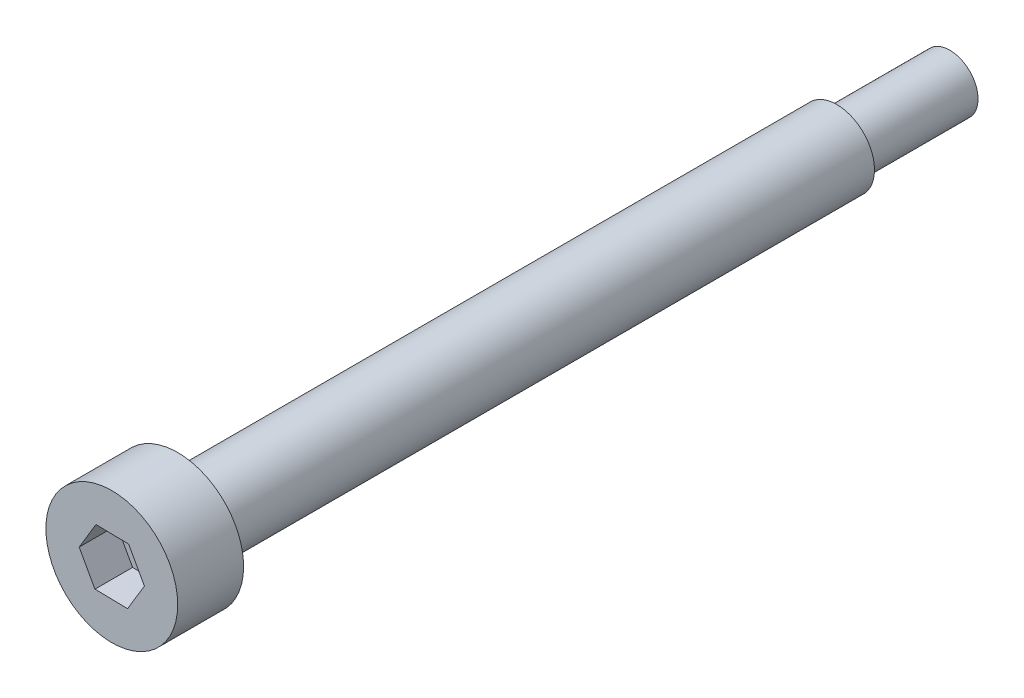
ISO-10303-21;
HEADER;
FILE_DESCRIPTION(('STEP AP214'),'2;1');
FILE_NAME('part.step','',(''),(''),'','','');
FILE_SCHEMA(('AUTOMOTIVE_DESIGN { 1 0 10303 214 1 1 1 1 }'));
ENDSEC;
DATA;
#1=APPLICATION_CONTEXT('core data for automotive mechanical design processes');
#2=APPLICATION_PROTOCOL_DEFINITION('international standard','automotive_design',2000,#1);
#3=PRODUCT_CONTEXT('',#1,'mechanical');
#4=PRODUCT('Part','Part','',(#3));
#5=PRODUCT_RELATED_PRODUCT_CATEGORY('part','',(#4));
#6=PRODUCT_DEFINITION_FORMATION('','',#4);
#7=PRODUCT_DEFINITION_CONTEXT('part definition',#1,'design');
#8=PRODUCT_DEFINITION('design','',#6,#7);
#9=PRODUCT_DEFINITION_SHAPE('','',#8);
#10=(LENGTH_UNIT() NAMED_UNIT(*) SI_UNIT(.MILLI.,.METRE.));
#11=(NAMED_UNIT(*) PLANE_ANGLE_UNIT() SI_UNIT($,.RADIAN.));
#12=(NAMED_UNIT(*) SI_UNIT($,.STERADIAN.) SOLID_ANGLE_UNIT());
#13=UNCERTAINTY_MEASURE_WITH_UNIT(LENGTH_MEASURE(1.E-05),#10,'distance_accuracy_value','');
#14=(GEOMETRIC_REPRESENTATION_CONTEXT(3) GLOBAL_UNCERTAINTY_ASSIGNED_CONTEXT((#13)) GLOBAL_UNIT_ASSIGNED_CONTEXT((#10,
#11,#12)) REPRESENTATION_CONTEXT('',''));
#15=CARTESIAN_POINT('',(0.,0.,0.));
#16=DIRECTION('',(0.,0.,1.));
#17=DIRECTION('',(1.,0.,0.));
#18=AXIS2_PLACEMENT_3D('',#15,#16,#17);
#19=CARTESIAN_POINT('',(0.,0.,3.5));
#20=DIRECTION('',(0.,0.,-1.));
#21=DIRECTION('',(-1.,0.,0.));
#22=AXIS2_PLACEMENT_3D('',#19,#20,#21);
#23=CYLINDRICAL_SURFACE('',#22,3.5);
#24=CARTESIAN_POINT('',(0.,0.,3.5));
#25=DIRECTION('',(0.,0.,1.));
#26=DIRECTION('',(1.,0.,0.));
#27=AXIS2_PLACEMENT_3D('',#24,#25,#26);
#28=CIRCLE('',#27,3.5);
#29=CARTESIAN_POINT('',(3.5,0.,3.5));
#30=VERTEX_POINT('',#29);
#31=EDGE_CURVE('E43',#30,#30,#28,.T.);
#32=ORIENTED_EDGE('',*,*,#31,.F.);
#33=EDGE_LOOP('',(#32));
#34=FACE_BOUND('',#33,.T.);
#35=CARTESIAN_POINT('',(0.,0.,0.));
#36=DIRECTION('',(0.,0.,1.));
#37=DIRECTION('',(1.,0.,0.));
#38=AXIS2_PLACEMENT_3D('',#35,#36,#37);
#39=CIRCLE('',#38,3.5);
#40=CARTESIAN_POINT('',(3.5,0.,0.));
#41=VERTEX_POINT('',#40);
#42=EDGE_CURVE('E138',#41,#41,#39,.T.);
#43=ORIENTED_EDGE('',*,*,#42,.T.);
#44=EDGE_LOOP('',(#43));
#45=FACE_BOUND('',#44,.T.);
#46=ADVANCED_FACE('F36',(#34,#45),#23,.T.);
#47=CARTESIAN_POINT('',(0.,0.,3.5));
#48=DIRECTION('',(0.,0.,1.));
#49=DIRECTION('',(1.,0.,0.));
#50=AXIS2_PLACEMENT_3D('',#47,#48,#49);
#51=PLANE('',#50);
#52=DIRECTION('',(-0.483885708586405,0.875131202178183,0.));
#53=VECTOR('',#52,1.);
#54=CARTESIAN_POINT('',(1.73175411943134,-0.0320572898511147,3.5));
#55=LINE('',#54,#53);
#56=CARTESIAN_POINT('',(1.73175411943134,-0.0320572898511147,3.5));
#57=VERTEX_POINT('',#56);
#58=CARTESIAN_POINT('',(0.893639487103215,1.48371441561033,3.5));
#59=VERTEX_POINT('',#58);
#60=EDGE_CURVE('E50',#57,#59,#55,.T.);
#61=ORIENTED_EDGE('',*,*,#60,.F.);
#62=DIRECTION('',(0.51594299843752,0.856622917253152,0.));
#63=VECTOR('',#62,1.);
#64=CARTESIAN_POINT('',(0.838114632328121,-1.51577170546145,3.5));
#65=LINE('',#64,#63);
#66=CARTESIAN_POINT('',(0.838114632328121,-1.51577170546145,3.5));
#67=VERTEX_POINT('',#66);
#68=EDGE_CURVE('E134',#67,#57,#65,.T.);
#69=ORIENTED_EDGE('',*,*,#68,.F.);
#70=DIRECTION('',(0.999828707023925,-0.0185082849250311,0.));
#71=VECTOR('',#70,1.);
#72=CARTESIAN_POINT('',(-0.893639487103214,-1.48371441561033,3.5));
#73=LINE('',#72,#71);
#74=CARTESIAN_POINT('',(-0.893639487103214,-1.48371441561033,3.5));
#75=VERTEX_POINT('',#74);
#76=EDGE_CURVE('E132',#75,#67,#73,.T.);
#77=ORIENTED_EDGE('',*,*,#76,.F.);
#78=DIRECTION('',(0.483885708586405,-0.875131202178183,0.));
#79=VECTOR('',#78,1.);
#80=CARTESIAN_POINT('',(-1.73175411943134,0.0320572898511147,3.5));
#81=LINE('',#80,#79);
#82=CARTESIAN_POINT('',(-1.73175411943134,0.0320572898511147,3.5));
#83=VERTEX_POINT('',#82);
#84=EDGE_CURVE('E98',#83,#75,#81,.T.);
#85=ORIENTED_EDGE('',*,*,#84,.F.);
#86=DIRECTION('',(-0.51594299843752,-0.856622917253152,0.));
#87=VECTOR('',#86,1.);
#88=CARTESIAN_POINT('',(-0.838114632328121,1.51577170546145,3.5));
#89=LINE('',#88,#87);
#90=CARTESIAN_POINT('',(-0.838114632328121,1.51577170546145,3.5));
#91=VERTEX_POINT('',#90);
#92=EDGE_CURVE('E128',#91,#83,#89,.T.);
#93=ORIENTED_EDGE('',*,*,#92,.F.);
#94=DIRECTION('',(-0.999828707023925,0.0185082849250311,0.));
#95=VECTOR('',#94,1.);
#96=CARTESIAN_POINT('',(0.893639487103215,1.48371441561033,3.5));
#97=LINE('',#96,#95);
#98=EDGE_CURVE('E124',#59,#91,#97,.T.);
#99=ORIENTED_EDGE('',*,*,#98,.F.);
#100=EDGE_LOOP('',(#61,#69,#77,#85,#93,#99));
#101=FACE_BOUND('',#100,.T.);
#102=ORIENTED_EDGE('',*,*,#31,.T.);
#103=EDGE_LOOP('',(#102));
#104=FACE_BOUND('',#103,.T.);
#105=ADVANCED_FACE('F152',(#101,#104),#51,.T.);
#106=CARTESIAN_POINT('',(0.,0.,0.));
#107=DIRECTION('',(0.,0.,1.));
#108=DIRECTION('',(1.,0.,0.));
#109=AXIS2_PLACEMENT_3D('',#106,#107,#108);
#110=PLANE('',#109);
#111=CARTESIAN_POINT('',(0.,0.,0.));
#112=DIRECTION('',(0.,0.,1.));
#113=DIRECTION('',(1.,0.,0.));
#114=AXIS2_PLACEMENT_3D('',#111,#112,#113);
#115=CIRCLE('',#114,2.);
#116=CARTESIAN_POINT('',(2.,0.,0.));
#117=VERTEX_POINT('',#116);
#118=EDGE_CURVE('E11',#117,#117,#115,.F.);
#119=ORIENTED_EDGE('',*,*,#118,.F.);
#120=EDGE_LOOP('',(#119));
#121=FACE_BOUND('',#120,.T.);
#122=ORIENTED_EDGE('',*,*,#42,.F.);
#123=EDGE_LOOP('',(#122));
#124=FACE_BOUND('',#123,.T.);
#125=ADVANCED_FACE('F149',(#121,#124),#110,.F.);
#126=CARTESIAN_POINT('',(1.73175411943134,-0.0320572898511147,1.5));
#127=DIRECTION('',(0.875131202178183,0.483885708586405,0.));
#128=DIRECTION('',(-0.483885708586405,0.875131202178183,0.));
#129=AXIS2_PLACEMENT_3D('',#126,#127,#128);
#130=PLANE('',#129);
#131=ORIENTED_EDGE('',*,*,#60,.T.);
#132=DIRECTION('',(0.,0.,1.));
#133=VECTOR('',#132,1.);
#134=CARTESIAN_POINT('',(0.893639487103215,1.48371441561033,1.5));
#135=LINE('',#134,#133);
#136=CARTESIAN_POINT('',(0.893639487103215,1.48371441561033,1.5));
#137=VERTEX_POINT('',#136);
#138=EDGE_CURVE('E80',#137,#59,#135,.T.);
#139=ORIENTED_EDGE('',*,*,#138,.F.);
#140=DIRECTION('',(-0.483885708586405,0.875131202178183,0.));
#141=VECTOR('',#140,1.);
#142=CARTESIAN_POINT('',(1.73175411943134,-0.0320572898511147,1.5));
#143=LINE('',#142,#141);
#144=CARTESIAN_POINT('',(1.73175411943134,-0.0320572898511147,1.5));
#145=VERTEX_POINT('',#144);
#146=EDGE_CURVE('E136',#145,#137,#143,.T.);
#147=ORIENTED_EDGE('',*,*,#146,.F.);
#148=DIRECTION('',(0.,0.,1.));
#149=VECTOR('',#148,1.);
#150=CARTESIAN_POINT('',(1.73175411943134,-0.0320572898511147,1.5));
#151=LINE('',#150,#149);
#152=EDGE_CURVE('E58',#145,#57,#151,.T.);
#153=ORIENTED_EDGE('',*,*,#152,.T.);
#154=EDGE_LOOP('',(#131,#139,#147,#153));
#155=FACE_BOUND('',#154,.T.);
#156=ADVANCED_FACE('F151',(#155),#130,.F.);
#157=CARTESIAN_POINT('',(0.838114632328121,-1.51577170546145,1.5));
#158=DIRECTION('',(0.856622917253152,-0.51594299843752,0.));
#159=DIRECTION('',(0.51594299843752,0.856622917253153,0.));
#160=AXIS2_PLACEMENT_3D('',#157,#158,#159);
#161=PLANE('',#160);
#162=ORIENTED_EDGE('',*,*,#68,.T.);
#163=ORIENTED_EDGE('',*,*,#152,.F.);
#164=DIRECTION('',(0.51594299843752,0.856622917253152,0.));
#165=VECTOR('',#164,1.);
#166=CARTESIAN_POINT('',(0.838114632328121,-1.51577170546145,1.5));
#167=LINE('',#166,#165);
#168=CARTESIAN_POINT('',(0.838114632328121,-1.51577170546145,1.5));
#169=VERTEX_POINT('',#168);
#170=EDGE_CURVE('E110',#169,#145,#167,.T.);
#171=ORIENTED_EDGE('',*,*,#170,.F.);
#172=DIRECTION('',(0.,0.,1.));
#173=VECTOR('',#172,1.);
#174=CARTESIAN_POINT('',(0.838114632328121,-1.51577170546145,1.5));
#175=LINE('',#174,#173);
#176=EDGE_CURVE('E102',#169,#67,#175,.T.);
#177=ORIENTED_EDGE('',*,*,#176,.T.);
#178=EDGE_LOOP('',(#162,#163,#171,#177));
#179=FACE_BOUND('',#178,.T.);
#180=ADVANCED_FACE('F158',(#179),#161,.F.);
#181=CARTESIAN_POINT('',(-0.893639487103214,-1.48371441561033,1.5));
#182=DIRECTION('',(-0.0185082849250311,-0.999828707023925,0.));
#183=DIRECTION('',(0.999828707023925,-0.0185082849250311,0.));
#184=AXIS2_PLACEMENT_3D('',#181,#182,#183);
#185=PLANE('',#184);
#186=ORIENTED_EDGE('',*,*,#76,.T.);
#187=ORIENTED_EDGE('',*,*,#176,.F.);
#188=DIRECTION('',(0.999828707023925,-0.0185082849250311,0.));
#189=VECTOR('',#188,1.);
#190=CARTESIAN_POINT('',(-0.893639487103214,-1.48371441561033,1.5));
#191=LINE('',#190,#189);
#192=CARTESIAN_POINT('',(-0.893639487103214,-1.48371441561033,1.5));
#193=VERTEX_POINT('',#192);
#194=EDGE_CURVE('E106',#193,#169,#191,.T.);
#195=ORIENTED_EDGE('',*,*,#194,.F.);
#196=DIRECTION('',(0.,0.,1.));
#197=VECTOR('',#196,1.);
#198=CARTESIAN_POINT('',(-0.893639487103214,-1.48371441561033,1.5));
#199=LINE('',#198,#197);
#200=EDGE_CURVE('E91',#193,#75,#199,.T.);
#201=ORIENTED_EDGE('',*,*,#200,.T.);
#202=EDGE_LOOP('',(#186,#187,#195,#201));
#203=FACE_BOUND('',#202,.T.);
#204=ADVANCED_FACE('F107',(#203),#185,.F.);
#205=CARTESIAN_POINT('',(-1.73175411943134,0.0320572898511147,1.5));
#206=DIRECTION('',(-0.875131202178183,-0.483885708586405,0.));
#207=DIRECTION('',(0.483885708586405,-0.875131202178183,0.));
#208=AXIS2_PLACEMENT_3D('',#205,#206,#207);
#209=PLANE('',#208);
#210=ORIENTED_EDGE('',*,*,#84,.T.);
#211=ORIENTED_EDGE('',*,*,#200,.F.);
#212=DIRECTION('',(0.483885708586405,-0.875131202178183,0.));
#213=VECTOR('',#212,1.);
#214=CARTESIAN_POINT('',(-1.73175411943134,0.0320572898511147,1.5));
#215=LINE('',#214,#213);
#216=CARTESIAN_POINT('',(-1.73175411943134,0.0320572898511147,1.5));
#217=VERTEX_POINT('',#216);
#218=EDGE_CURVE('E95',#217,#193,#215,.T.);
#219=ORIENTED_EDGE('',*,*,#218,.F.);
#220=DIRECTION('',(0.,0.,1.));
#221=VECTOR('',#220,1.);
#222=CARTESIAN_POINT('',(-1.73175411943134,0.0320572898511147,1.5));
#223=LINE('',#222,#221);
#224=EDGE_CURVE('E103',#217,#83,#223,.T.);
#225=ORIENTED_EDGE('',*,*,#224,.T.);
#226=EDGE_LOOP('',(#210,#211,#219,#225));
#227=FACE_BOUND('',#226,.T.);
#228=ADVANCED_FACE('F93',(#227),#209,.F.);
#229=CARTESIAN_POINT('',(-0.838114632328121,1.51577170546145,1.5));
#230=DIRECTION('',(-0.856622917253152,0.51594299843752,0.));
#231=DIRECTION('',(-0.51594299843752,-0.856622917253153,0.));
#232=AXIS2_PLACEMENT_3D('',#229,#230,#231);
#233=PLANE('',#232);
#234=ORIENTED_EDGE('',*,*,#92,.T.);
#235=ORIENTED_EDGE('',*,*,#224,.F.);
#236=DIRECTION('',(-0.51594299843752,-0.856622917253152,0.));
#237=VECTOR('',#236,1.);
#238=CARTESIAN_POINT('',(-0.838114632328121,1.51577170546145,1.5));
#239=LINE('',#238,#237);
#240=CARTESIAN_POINT('',(-0.838114632328121,1.51577170546145,1.5));
#241=VERTEX_POINT('',#240);
#242=EDGE_CURVE('E116',#241,#217,#239,.T.);
#243=ORIENTED_EDGE('',*,*,#242,.F.);
#244=DIRECTION('',(0.,0.,1.));
#245=VECTOR('',#244,1.);
#246=CARTESIAN_POINT('',(-0.838114632328121,1.51577170546145,1.5));
#247=LINE('',#246,#245);
#248=EDGE_CURVE('E141',#241,#91,#247,.T.);
#249=ORIENTED_EDGE('',*,*,#248,.T.);
#250=EDGE_LOOP('',(#234,#235,#243,#249));
#251=FACE_BOUND('',#250,.T.);
#252=ADVANCED_FACE('F205',(#251),#233,.F.);
#253=CARTESIAN_POINT('',(0.893639487103215,1.48371441561033,1.5));
#254=DIRECTION('',(0.0185082849250311,0.999828707023925,0.));
#255=DIRECTION('',(-0.999828707023925,0.0185082849250311,0.));
#256=AXIS2_PLACEMENT_3D('',#253,#254,#255);
#257=PLANE('',#256);
#258=ORIENTED_EDGE('',*,*,#98,.T.);
#259=ORIENTED_EDGE('',*,*,#248,.F.);
#260=DIRECTION('',(-0.999828707023925,0.0185082849250311,0.));
#261=VECTOR('',#260,1.);
#262=CARTESIAN_POINT('',(0.893639487103215,1.48371441561033,1.5));
#263=LINE('',#262,#261);
#264=EDGE_CURVE('E118',#137,#241,#263,.T.);
#265=ORIENTED_EDGE('',*,*,#264,.F.);
#266=ORIENTED_EDGE('',*,*,#138,.T.);
#267=EDGE_LOOP('',(#258,#259,#265,#266));
#268=FACE_BOUND('',#267,.T.);
#269=ADVANCED_FACE('F214',(#268),#257,.F.);
#270=CARTESIAN_POINT('',(0.,0.,1.5));
#271=DIRECTION('',(0.,0.,1.));
#272=DIRECTION('',(1.,0.,0.));
#273=AXIS2_PLACEMENT_3D('',#270,#271,#272);
#274=PLANE('',#273);
#275=ORIENTED_EDGE('',*,*,#146,.T.);
#276=ORIENTED_EDGE('',*,*,#264,.T.);
#277=ORIENTED_EDGE('',*,*,#242,.T.);
#278=ORIENTED_EDGE('',*,*,#218,.T.);
#279=ORIENTED_EDGE('',*,*,#194,.T.);
#280=ORIENTED_EDGE('',*,*,#170,.T.);
#281=EDGE_LOOP('',(#275,#276,#277,#278,#279,#280));
#282=FACE_BOUND('',#281,.T.);
#283=ADVANCED_FACE('F113',(#282),#274,.T.);
#284=CARTESIAN_POINT('',(0.,0.,-35.));
#285=DIRECTION('',(0.,0.,1.));
#286=DIRECTION('',(1.,0.,0.));
#287=AXIS2_PLACEMENT_3D('',#284,#285,#286);
#288=CYLINDRICAL_SURFACE('',#287,2.);
#289=CARTESIAN_POINT('',(0.,0.,-35.));
#290=DIRECTION('',(0.,0.,-1.));
#291=DIRECTION('',(-1.,0.,0.));
#292=AXIS2_PLACEMENT_3D('',#289,#290,#291);
#293=CIRCLE('',#292,2.);
#294=CARTESIAN_POINT('',(-2.,0.,-35.));
#295=VERTEX_POINT('',#294);
#296=EDGE_CURVE('E125',#295,#295,#293,.T.);
#297=ORIENTED_EDGE('',*,*,#296,.F.);
#298=EDGE_LOOP('',(#297));
#299=FACE_BOUND('',#298,.T.);
#300=ORIENTED_EDGE('',*,*,#118,.T.);
#301=EDGE_LOOP('',(#300));
#302=FACE_BOUND('',#301,.T.);
#303=ADVANCED_FACE('F232',(#299,#302),#288,.T.);
#304=CARTESIAN_POINT('',(0.,0.,-35.));
#305=DIRECTION('',(0.,0.,-1.));
#306=DIRECTION('',(-1.,0.,0.));
#307=AXIS2_PLACEMENT_3D('',#304,#305,#306);
#308=PLANE('',#307);
#309=CARTESIAN_POINT('',(0.,0.,-35.));
#310=DIRECTION('',(0.,0.,-1.));
#311=DIRECTION('',(-1.,0.,0.));
#312=AXIS2_PLACEMENT_3D('',#309,#310,#311);
#313=CIRCLE('',#312,1.5);
#314=CARTESIAN_POINT('',(-1.5,0.,-35.));
#315=VERTEX_POINT('',#314);
#316=EDGE_CURVE('E284',#315,#315,#313,.T.);
#317=ORIENTED_EDGE('',*,*,#316,.F.);
#318=EDGE_LOOP('',(#317));
#319=FACE_BOUND('',#318,.T.);
#320=ORIENTED_EDGE('',*,*,#296,.T.);
#321=EDGE_LOOP('',(#320));
#322=FACE_BOUND('',#321,.T.);
#323=ADVANCED_FACE('F245',(#319,#322),#308,.T.);
#324=CARTESIAN_POINT('',(0.,0.,-41.));
#325=DIRECTION('',(0.,0.,1.));
#326=DIRECTION('',(1.,0.,0.));
#327=AXIS2_PLACEMENT_3D('',#324,#325,#326);
#328=CYLINDRICAL_SURFACE('',#327,1.5);
#329=CARTESIAN_POINT('',(0.,0.,-41.));
#330=DIRECTION('',(0.,0.,-1.));
#331=DIRECTION('',(-1.,0.,0.));
#332=AXIS2_PLACEMENT_3D('',#329,#330,#331);
#333=CIRCLE('',#332,1.5);
#334=CARTESIAN_POINT('',(-1.5,0.,-41.));
#335=VERTEX_POINT('',#334);
#336=EDGE_CURVE('E283',#335,#335,#333,.T.);
#337=ORIENTED_EDGE('',*,*,#336,.F.);
#338=EDGE_LOOP('',(#337));
#339=FACE_BOUND('',#338,.T.);
#340=ORIENTED_EDGE('',*,*,#316,.T.);
#341=EDGE_LOOP('',(#340));
#342=FACE_BOUND('',#341,.T.);
#343=ADVANCED_FACE('F255',(#339,#342),#328,.T.);
#344=CARTESIAN_POINT('',(0.,0.,-41.));
#345=DIRECTION('',(0.,0.,-1.));
#346=DIRECTION('',(-1.,0.,0.));
#347=AXIS2_PLACEMENT_3D('',#344,#345,#346);
#348=PLANE('',#347);
#349=ORIENTED_EDGE('',*,*,#336,.T.);
#350=EDGE_LOOP('',(#349));
#351=FACE_BOUND('',#350,.T.);
#352=ADVANCED_FACE('F266',(#351),#348,.T.);
#353=CLOSED_SHELL('',(#46,#105,#125,#156,#180,#204,#228,#252,#269,#283,#303,#323,#343,#352));
#354=MANIFOLD_SOLID_BREP('B2',#353);
#355=ADVANCED_BREP_SHAPE_REPRESENTATION('',(#18,#354),#14);
#356=SHAPE_DEFINITION_REPRESENTATION(#9,#355);
ENDSEC;
END-ISO-10303-21;
